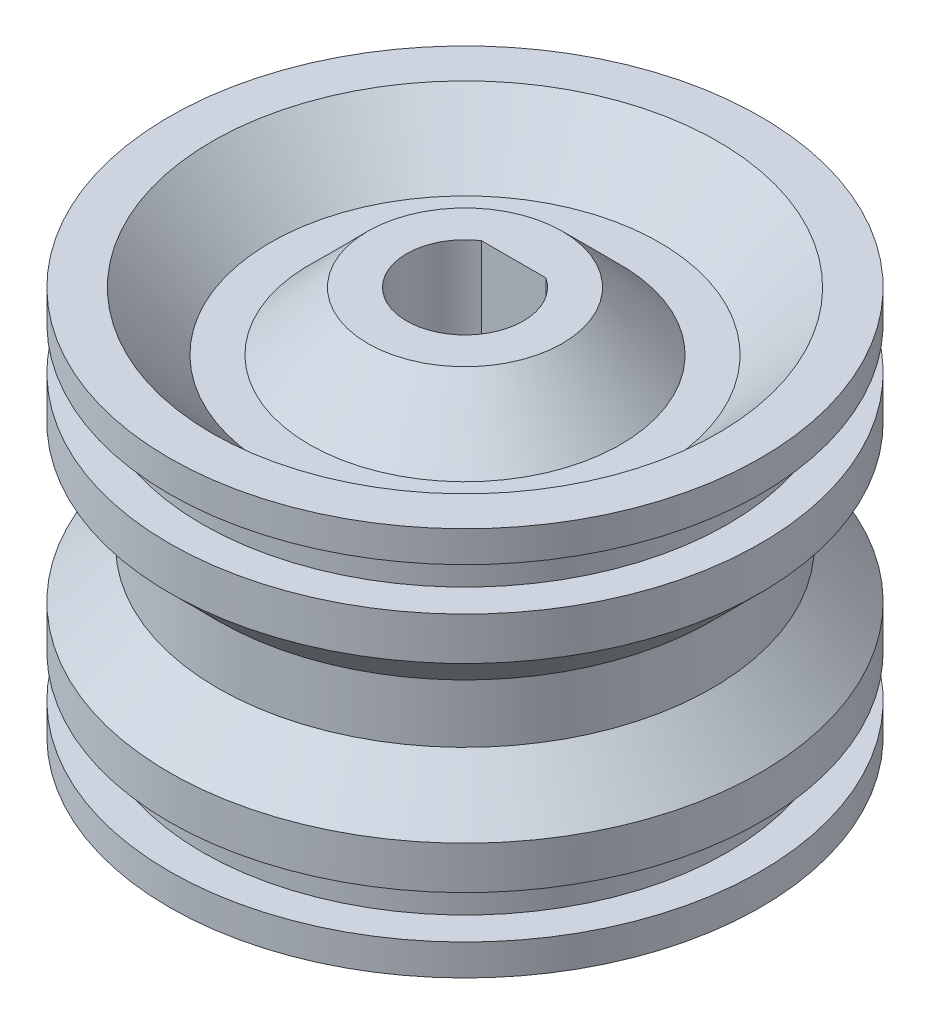
ISO-10303-21;
HEADER;
FILE_DESCRIPTION(('STEP AP214'),'2;1');
FILE_NAME('part.step','',(''),(''),'','','');
FILE_SCHEMA(('AUTOMOTIVE_DESIGN { 1 0 10303 214 1 1 1 1 }'));
ENDSEC;
DATA;
#1=APPLICATION_CONTEXT('core data for automotive mechanical design processes');
#2=APPLICATION_PROTOCOL_DEFINITION('international standard','automotive_design',2000,#1);
#3=PRODUCT_CONTEXT('',#1,'mechanical');
#4=PRODUCT('Part','Part','',(#3));
#5=PRODUCT_RELATED_PRODUCT_CATEGORY('part','',(#4));
#6=PRODUCT_DEFINITION_FORMATION('','',#4);
#7=PRODUCT_DEFINITION_CONTEXT('part definition',#1,'design');
#8=PRODUCT_DEFINITION('design','',#6,#7);
#9=PRODUCT_DEFINITION_SHAPE('','',#8);
#10=(LENGTH_UNIT() NAMED_UNIT(*) SI_UNIT(.MILLI.,.METRE.));
#11=(NAMED_UNIT(*) PLANE_ANGLE_UNIT() SI_UNIT($,.RADIAN.));
#12=(NAMED_UNIT(*) SI_UNIT($,.STERADIAN.) SOLID_ANGLE_UNIT());
#13=UNCERTAINTY_MEASURE_WITH_UNIT(LENGTH_MEASURE(1.E-05),#10,'distance_accuracy_value','');
#14=(GEOMETRIC_REPRESENTATION_CONTEXT(3) GLOBAL_UNCERTAINTY_ASSIGNED_CONTEXT((#13)) GLOBAL_UNIT_ASSIGNED_CONTEXT((#10,
#11,#12)) REPRESENTATION_CONTEXT('',''));
#15=CARTESIAN_POINT('',(0.,0.,0.));
#16=DIRECTION('',(0.,0.,1.));
#17=DIRECTION('',(1.,0.,0.));
#18=AXIS2_PLACEMENT_3D('',#15,#16,#17);
#19=CARTESIAN_POINT('',(0.,10.,0.));
#20=DIRECTION('',(0.,-1.,0.));
#21=DIRECTION('',(0.,0.,-1.));
#22=AXIS2_PLACEMENT_3D('',#19,#20,#21);
#23=CYLINDRICAL_SURFACE('',#22,15.2);
#24=CARTESIAN_POINT('',(0.,-4.,0.));
#25=DIRECTION('',(0.,-1.,0.));
#26=DIRECTION('',(0.,0.,-1.));
#27=AXIS2_PLACEMENT_3D('',#24,#25,#26);
#28=CIRCLE('',#27,15.2);
#29=CARTESIAN_POINT('',(0.,-4.,-15.2));
#30=VERTEX_POINT('',#29);
#31=EDGE_CURVE('E419',#30,#30,#28,.T.);
#32=ORIENTED_EDGE('',*,*,#31,.T.);
#33=EDGE_LOOP('',(#32));
#34=FACE_BOUND('',#33,.T.);
#35=CARTESIAN_POINT('',(0.,-6.2,0.));
#36=DIRECTION('',(0.,1.,0.));
#37=DIRECTION('',(0.,0.,1.));
#38=AXIS2_PLACEMENT_3D('',#35,#36,#37);
#39=CIRCLE('',#38,15.2);
#40=CARTESIAN_POINT('',(0.,-6.2,15.2));
#41=VERTEX_POINT('',#40);
#42=EDGE_CURVE('E103',#41,#41,#39,.T.);
#43=ORIENTED_EDGE('',*,*,#42,.T.);
#44=EDGE_LOOP('',(#43));
#45=FACE_BOUND('',#44,.T.);
#46=ADVANCED_FACE('F45',(#34,#45),#23,.T.);
#47=CARTESIAN_POINT('',(0.,10.,0.));
#48=DIRECTION('',(0.,1.,0.));
#49=DIRECTION('',(0.,0.,1.));
#50=AXIS2_PLACEMENT_3D('',#47,#48,#49);
#51=PLANE('',#50);
#52=CARTESIAN_POINT('',(0.,10.,0.));
#53=DIRECTION('',(0.,1.,0.));
#54=DIRECTION('',(0.,0.,1.));
#55=AXIS2_PLACEMENT_3D('',#52,#53,#54);
#56=CIRCLE('',#55,3.);
#57=CARTESIAN_POINT('',(-1.6583123951777,10.,-2.5));
#58=VERTEX_POINT('',#57);
#59=CARTESIAN_POINT('',(1.6583123951777,10.,-2.5));
#60=VERTEX_POINT('',#59);
#61=EDGE_CURVE('E81',#58,#60,#56,.T.);
#62=ORIENTED_EDGE('',*,*,#61,.F.);
#63=DIRECTION('',(1.,0.,0.));
#64=VECTOR('',#63,1.);
#65=CARTESIAN_POINT('',(0.,10.,-2.5));
#66=LINE('',#65,#64);
#67=EDGE_CURVE('E61',#58,#60,#66,.T.);
#68=ORIENTED_EDGE('',*,*,#67,.T.);
#69=EDGE_LOOP('',(#62,#68));
#70=FACE_BOUND('',#69,.T.);
#71=CARTESIAN_POINT('',(0.,10.,0.));
#72=DIRECTION('',(0.,1.,0.));
#73=DIRECTION('',(0.,0.,1.));
#74=AXIS2_PLACEMENT_3D('',#71,#72,#73);
#75=CIRCLE('',#74,5.);
#76=CARTESIAN_POINT('',(0.,10.,5.));
#77=VERTEX_POINT('',#76);
#78=EDGE_CURVE('E90',#77,#77,#75,.T.);
#79=ORIENTED_EDGE('',*,*,#78,.T.);
#80=EDGE_LOOP('',(#79));
#81=FACE_BOUND('',#80,.T.);
#82=ADVANCED_FACE('F85',(#70,#81),#51,.T.);
#83=CARTESIAN_POINT('',(0.,10.,0.));
#84=DIRECTION('',(0.,1.,0.));
#85=DIRECTION('',(0.,0.,1.));
#86=AXIS2_PLACEMENT_3D('',#83,#84,#85);
#87=CIRCLE('',#86,13.);
#88=CARTESIAN_POINT('',(0.,10.,13.));
#89=VERTEX_POINT('',#88);
#90=EDGE_CURVE('E136',#89,#89,#87,.F.);
#91=ORIENTED_EDGE('',*,*,#90,.T.);
#92=EDGE_LOOP('',(#91));
#93=FACE_BOUND('',#92,.T.);
#94=CARTESIAN_POINT('',(0.,10.,0.));
#95=DIRECTION('',(0.,1.,0.));
#96=DIRECTION('',(0.,0.,1.));
#97=AXIS2_PLACEMENT_3D('',#94,#95,#96);
#98=CIRCLE('',#97,15.2);
#99=CARTESIAN_POINT('',(0.,10.,15.2));
#100=VERTEX_POINT('',#99);
#101=EDGE_CURVE('E119',#100,#100,#98,.T.);
#102=ORIENTED_EDGE('',*,*,#101,.T.);
#103=EDGE_LOOP('',(#102));
#104=FACE_BOUND('',#103,.T.);
#105=ADVANCED_FACE('F170',(#93,#104),#51,.T.);
#106=CARTESIAN_POINT('',(0.,2.,0.));
#107=DIRECTION('',(0.,-1.,0.));
#108=DIRECTION('',(0.,0.,-1.));
#109=AXIS2_PLACEMENT_3D('',#106,#107,#108);
#110=PLANE('',#109);
#111=CARTESIAN_POINT('',(0.,2.,0.));
#112=DIRECTION('',(0.,-1.,0.));
#113=DIRECTION('',(0.,0.,-1.));
#114=AXIS2_PLACEMENT_3D('',#111,#112,#113);
#115=CIRCLE('',#114,7.99999999999998);
#116=CARTESIAN_POINT('',(0.,2.,-7.99999999999998));
#117=VERTEX_POINT('',#116);
#118=EDGE_CURVE('E54',#117,#117,#115,.T.);
#119=ORIENTED_EDGE('',*,*,#118,.T.);
#120=EDGE_LOOP('',(#119));
#121=FACE_BOUND('',#120,.T.);
#122=CARTESIAN_POINT('',(0.,2.,0.));
#123=DIRECTION('',(0.,-1.,0.));
#124=DIRECTION('',(0.,0.,-1.));
#125=AXIS2_PLACEMENT_3D('',#122,#123,#124);
#126=CIRCLE('',#125,3.);
#127=CARTESIAN_POINT('',(1.6583123951777,2.,-2.5));
#128=VERTEX_POINT('',#127);
#129=CARTESIAN_POINT('',(-1.6583123951777,2.,-2.5));
#130=VERTEX_POINT('',#129);
#131=EDGE_CURVE('E122',#128,#130,#126,.T.);
#132=ORIENTED_EDGE('',*,*,#131,.F.);
#133=DIRECTION('',(-1.,0.,0.));
#134=VECTOR('',#133,1.);
#135=CARTESIAN_POINT('',(0.,2.,-2.5));
#136=LINE('',#135,#134);
#137=EDGE_CURVE('E75',#128,#130,#136,.T.);
#138=ORIENTED_EDGE('',*,*,#137,.T.);
#139=EDGE_LOOP('',(#132,#138));
#140=FACE_BOUND('',#139,.T.);
#141=ADVANCED_FACE('F147',(#121,#140),#110,.T.);
#142=CARTESIAN_POINT('',(0.,4.,0.));
#143=DIRECTION('',(0.,-1.,0.));
#144=DIRECTION('',(0.,0.,-1.));
#145=AXIS2_PLACEMENT_3D('',#142,#143,#144);
#146=CIRCLE('',#145,15.2);
#147=CARTESIAN_POINT('',(0.,4.,-15.2));
#148=VERTEX_POINT('',#147);
#149=EDGE_CURVE('E413',#148,#148,#146,.T.);
#150=ORIENTED_EDGE('',*,*,#149,.F.);
#151=EDGE_LOOP('',(#150));
#152=FACE_BOUND('',#151,.T.);
#153=CARTESIAN_POINT('',(0.,6.2,0.));
#154=DIRECTION('',(0.,1.,0.));
#155=DIRECTION('',(0.,0.,1.));
#156=AXIS2_PLACEMENT_3D('',#153,#154,#155);
#157=CIRCLE('',#156,15.2);
#158=CARTESIAN_POINT('',(0.,6.2,15.2));
#159=VERTEX_POINT('',#158);
#160=EDGE_CURVE('E115',#159,#159,#157,.T.);
#161=ORIENTED_EDGE('',*,*,#160,.F.);
#162=EDGE_LOOP('',(#161));
#163=FACE_BOUND('',#162,.T.);
#164=ADVANCED_FACE('F164',(#152,#163),#23,.T.);
#165=CARTESIAN_POINT('',(15.2,6.2,0.));
#166=DIRECTION('',(0.,1.,0.));
#167=DIRECTION('',(0.,0.,1.));
#168=AXIS2_PLACEMENT_3D('',#165,#166,#167);
#169=PLANE('',#168);
#170=ORIENTED_EDGE('',*,*,#160,.T.);
#171=EDGE_LOOP('',(#170));
#172=FACE_BOUND('',#171,.T.);
#173=CARTESIAN_POINT('',(0.,6.2,0.));
#174=DIRECTION('',(0.,1.,0.));
#175=DIRECTION('',(0.,0.,1.));
#176=AXIS2_PLACEMENT_3D('',#173,#174,#175);
#177=CIRCLE('',#176,13.5);
#178=CARTESIAN_POINT('',(0.,6.2,13.5));
#179=VERTEX_POINT('',#178);
#180=EDGE_CURVE('E112',#179,#179,#177,.T.);
#181=ORIENTED_EDGE('',*,*,#180,.F.);
#182=EDGE_LOOP('',(#181));
#183=FACE_BOUND('',#182,.T.);
#184=ADVANCED_FACE('F181',(#172,#183),#169,.T.);
#185=CARTESIAN_POINT('',(0.,8.4,0.));
#186=DIRECTION('',(0.,1.,0.));
#187=DIRECTION('',(0.,0.,1.));
#188=AXIS2_PLACEMENT_3D('',#185,#186,#187);
#189=CYLINDRICAL_SURFACE('',#188,13.5);
#190=ORIENTED_EDGE('',*,*,#180,.T.);
#191=EDGE_LOOP('',(#190));
#192=FACE_BOUND('',#191,.T.);
#193=CARTESIAN_POINT('',(0.,8.4,0.));
#194=DIRECTION('',(0.,1.,0.));
#195=DIRECTION('',(0.,0.,1.));
#196=AXIS2_PLACEMENT_3D('',#193,#194,#195);
#197=CIRCLE('',#196,13.5);
#198=CARTESIAN_POINT('',(0.,8.4,13.5));
#199=VERTEX_POINT('',#198);
#200=EDGE_CURVE('E109',#199,#199,#197,.T.);
#201=ORIENTED_EDGE('',*,*,#200,.F.);
#202=EDGE_LOOP('',(#201));
#203=FACE_BOUND('',#202,.T.);
#204=ADVANCED_FACE('F187',(#192,#203),#189,.T.);
#205=CARTESIAN_POINT('',(15.2,8.4,0.));
#206=DIRECTION('',(0.,-1.,0.));
#207=DIRECTION('',(0.,0.,-1.));
#208=AXIS2_PLACEMENT_3D('',#205,#206,#207);
#209=PLANE('',#208);
#210=ORIENTED_EDGE('',*,*,#200,.T.);
#211=EDGE_LOOP('',(#210));
#212=FACE_BOUND('',#211,.T.);
#213=CARTESIAN_POINT('',(0.,8.4,0.));
#214=DIRECTION('',(0.,1.,0.));
#215=DIRECTION('',(0.,0.,1.));
#216=AXIS2_PLACEMENT_3D('',#213,#214,#215);
#217=CIRCLE('',#216,15.2);
#218=CARTESIAN_POINT('',(0.,8.4,15.2));
#219=VERTEX_POINT('',#218);
#220=EDGE_CURVE('E106',#219,#219,#217,.T.);
#221=ORIENTED_EDGE('',*,*,#220,.F.);
#222=EDGE_LOOP('',(#221));
#223=FACE_BOUND('',#222,.T.);
#224=ADVANCED_FACE('F196',(#212,#223),#209,.T.);
#225=ORIENTED_EDGE('',*,*,#101,.F.);
#226=EDGE_LOOP('',(#225));
#227=FACE_BOUND('',#226,.T.);
#228=ORIENTED_EDGE('',*,*,#220,.T.);
#229=EDGE_LOOP('',(#228));
#230=FACE_BOUND('',#229,.T.);
#231=ADVANCED_FACE('F180',(#227,#230),#23,.T.);
#232=CARTESIAN_POINT('',(15.2,-6.2,0.));
#233=DIRECTION('',(0.,-1.,0.));
#234=DIRECTION('',(0.,0.,1.));
#235=AXIS2_PLACEMENT_3D('',#232,#233,#234);
#236=PLANE('',#235);
#237=ORIENTED_EDGE('',*,*,#42,.F.);
#238=EDGE_LOOP('',(#237));
#239=FACE_BOUND('',#238,.T.);
#240=CARTESIAN_POINT('',(0.,-6.2,0.));
#241=DIRECTION('',(0.,1.,0.));
#242=DIRECTION('',(0.,0.,1.));
#243=AXIS2_PLACEMENT_3D('',#240,#241,#242);
#244=CIRCLE('',#243,13.5);
#245=CARTESIAN_POINT('',(0.,-6.2,13.5));
#246=VERTEX_POINT('',#245);
#247=EDGE_CURVE('E100',#246,#246,#244,.T.);
#248=ORIENTED_EDGE('',*,*,#247,.T.);
#249=EDGE_LOOP('',(#248));
#250=FACE_BOUND('',#249,.T.);
#251=ADVANCED_FACE('F195',(#239,#250),#236,.T.);
#252=CARTESIAN_POINT('',(0.,-8.4,0.));
#253=DIRECTION('',(0.,-1.,0.));
#254=DIRECTION('',(0.,0.,1.));
#255=AXIS2_PLACEMENT_3D('',#252,#253,#254);
#256=CYLINDRICAL_SURFACE('',#255,13.5);
#257=ORIENTED_EDGE('',*,*,#247,.F.);
#258=EDGE_LOOP('',(#257));
#259=FACE_BOUND('',#258,.T.);
#260=CARTESIAN_POINT('',(0.,-8.4,0.));
#261=DIRECTION('',(0.,1.,0.));
#262=DIRECTION('',(0.,0.,1.));
#263=AXIS2_PLACEMENT_3D('',#260,#261,#262);
#264=CIRCLE('',#263,13.5);
#265=CARTESIAN_POINT('',(0.,-8.4,13.5));
#266=VERTEX_POINT('',#265);
#267=EDGE_CURVE('E97',#266,#266,#264,.T.);
#268=ORIENTED_EDGE('',*,*,#267,.T.);
#269=EDGE_LOOP('',(#268));
#270=FACE_BOUND('',#269,.T.);
#271=ADVANCED_FACE('F202',(#259,#270),#256,.T.);
#272=CARTESIAN_POINT('',(15.2,-8.4,0.));
#273=DIRECTION('',(0.,1.,0.));
#274=DIRECTION('',(0.,0.,-1.));
#275=AXIS2_PLACEMENT_3D('',#272,#273,#274);
#276=PLANE('',#275);
#277=ORIENTED_EDGE('',*,*,#267,.F.);
#278=EDGE_LOOP('',(#277));
#279=FACE_BOUND('',#278,.T.);
#280=CARTESIAN_POINT('',(0.,-8.4,0.));
#281=DIRECTION('',(0.,1.,0.));
#282=DIRECTION('',(0.,0.,1.));
#283=AXIS2_PLACEMENT_3D('',#280,#281,#282);
#284=CIRCLE('',#283,15.2);
#285=CARTESIAN_POINT('',(0.,-8.4,15.2));
#286=VERTEX_POINT('',#285);
#287=EDGE_CURVE('E77',#286,#286,#284,.T.);
#288=ORIENTED_EDGE('',*,*,#287,.T.);
#289=EDGE_LOOP('',(#288));
#290=FACE_BOUND('',#289,.T.);
#291=ADVANCED_FACE('F219',(#279,#290),#276,.T.);
#292=CARTESIAN_POINT('',(0.,-10.,0.));
#293=DIRECTION('',(0.,1.,0.));
#294=DIRECTION('',(0.,0.,1.));
#295=AXIS2_PLACEMENT_3D('',#292,#293,#294);
#296=PLANE('',#295);
#297=CARTESIAN_POINT('',(0.,-10.,0.));
#298=DIRECTION('',(0.,1.,0.));
#299=DIRECTION('',(0.,0.,1.));
#300=AXIS2_PLACEMENT_3D('',#297,#298,#299);
#301=CIRCLE('',#300,13.);
#302=CARTESIAN_POINT('',(0.,-10.,13.));
#303=VERTEX_POINT('',#302);
#304=EDGE_CURVE('E130',#303,#303,#301,.T.);
#305=ORIENTED_EDGE('',*,*,#304,.T.);
#306=EDGE_LOOP('',(#305));
#307=FACE_BOUND('',#306,.T.);
#308=CARTESIAN_POINT('',(0.,-10.,0.));
#309=DIRECTION('',(0.,1.,0.));
#310=DIRECTION('',(0.,0.,1.));
#311=AXIS2_PLACEMENT_3D('',#308,#309,#310);
#312=CIRCLE('',#311,15.2);
#313=CARTESIAN_POINT('',(0.,-10.,15.2));
#314=VERTEX_POINT('',#313);
#315=EDGE_CURVE('E118',#314,#314,#312,.T.);
#316=ORIENTED_EDGE('',*,*,#315,.F.);
#317=EDGE_LOOP('',(#316));
#318=FACE_BOUND('',#317,.T.);
#319=ADVANCED_FACE('F178',(#307,#318),#296,.F.);
#320=ORIENTED_EDGE('',*,*,#315,.T.);
#321=EDGE_LOOP('',(#320));
#322=FACE_BOUND('',#321,.T.);
#323=ORIENTED_EDGE('',*,*,#287,.F.);
#324=EDGE_LOOP('',(#323));
#325=FACE_BOUND('',#324,.T.);
#326=ADVANCED_FACE('F163',(#322,#325),#23,.T.);
#327=CARTESIAN_POINT('',(0.,2.,0.));
#328=DIRECTION('',(0.,-1.,0.));
#329=DIRECTION('',(0.,0.,-1.));
#330=AXIS2_PLACEMENT_3D('',#327,#328,#329);
#331=CYLINDRICAL_SURFACE('',#330,9.99999999999999);
#332=CARTESIAN_POINT('',(0.,0.,0.));
#333=DIRECTION('',(0.,-1.,0.));
#334=DIRECTION('',(0.,0.,-1.));
#335=AXIS2_PLACEMENT_3D('',#332,#333,#334);
#336=CIRCLE('',#335,9.99999999999999);
#337=CARTESIAN_POINT('',(0.,0.,-9.99999999999999));
#338=VERTEX_POINT('',#337);
#339=EDGE_CURVE('E11',#338,#338,#336,.F.);
#340=ORIENTED_EDGE('',*,*,#339,.T.);
#341=EDGE_LOOP('',(#340));
#342=FACE_BOUND('',#341,.T.);
#343=CARTESIAN_POINT('',(0.,-7.,0.));
#344=DIRECTION('',(0.,1.,0.));
#345=DIRECTION('',(0.,0.,1.));
#346=AXIS2_PLACEMENT_3D('',#343,#344,#345);
#347=CIRCLE('',#346,9.99999999999999);
#348=CARTESIAN_POINT('',(0.,-7.,9.99999999999999));
#349=VERTEX_POINT('',#348);
#350=EDGE_CURVE('E127',#349,#349,#347,.F.);
#351=ORIENTED_EDGE('',*,*,#350,.T.);
#352=EDGE_LOOP('',(#351));
#353=FACE_BOUND('',#352,.T.);
#354=ADVANCED_FACE('F177',(#342,#353),#331,.F.);
#355=CARTESIAN_POINT('',(0.,-5.,-2.5));
#356=DIRECTION('',(0.,0.,1.));
#357=DIRECTION('',(1.,0.,0.));
#358=AXIS2_PLACEMENT_3D('',#355,#356,#357);
#359=PLANE('',#358);
#360=DIRECTION('',(0.,1.,0.));
#361=VECTOR('',#360,1.);
#362=CARTESIAN_POINT('',(1.6583123951777,-5.,-2.5));
#363=LINE('',#362,#361);
#364=EDGE_CURVE('E68',#128,#60,#363,.T.);
#365=ORIENTED_EDGE('',*,*,#364,.T.);
#366=ORIENTED_EDGE('',*,*,#67,.F.);
#367=DIRECTION('',(0.,1.,0.));
#368=VECTOR('',#367,1.);
#369=CARTESIAN_POINT('',(-1.6583123951777,-5.,-2.5));
#370=LINE('',#369,#368);
#371=EDGE_CURVE('E78',#130,#58,#370,.T.);
#372=ORIENTED_EDGE('',*,*,#371,.F.);
#373=ORIENTED_EDGE('',*,*,#137,.F.);
#374=EDGE_LOOP('',(#365,#366,#372,#373));
#375=FACE_BOUND('',#374,.T.);
#376=ADVANCED_FACE('F73',(#375),#359,.T.);
#377=CARTESIAN_POINT('',(0.,-5.,0.));
#378=DIRECTION('',(0.,1.,0.));
#379=DIRECTION('',(0.,0.,1.));
#380=AXIS2_PLACEMENT_3D('',#377,#378,#379);
#381=CYLINDRICAL_SURFACE('',#380,3.);
#382=ORIENTED_EDGE('',*,*,#131,.T.);
#383=ORIENTED_EDGE('',*,*,#371,.T.);
#384=ORIENTED_EDGE('',*,*,#61,.T.);
#385=ORIENTED_EDGE('',*,*,#364,.F.);
#386=EDGE_LOOP('',(#382,#383,#384,#385));
#387=FACE_BOUND('',#386,.T.);
#388=ADVANCED_FACE('F82',(#387),#381,.F.);
#389=CARTESIAN_POINT('',(0.,-7.,0.));
#390=DIRECTION('',(0.,-1.,0.));
#391=DIRECTION('',(0.,0.,-1.));
#392=AXIS2_PLACEMENT_3D('',#389,#390,#391);
#393=CONICAL_SURFACE('',#392,9.99999999999999,0.78539816339745);
#394=ORIENTED_EDGE('',*,*,#304,.F.);
#395=EDGE_LOOP('',(#394));
#396=FACE_BOUND('',#395,.T.);
#397=ORIENTED_EDGE('',*,*,#350,.F.);
#398=EDGE_LOOP('',(#397));
#399=FACE_BOUND('',#398,.T.);
#400=ADVANCED_FACE('F235',(#396,#399),#393,.F.);
#401=CARTESIAN_POINT('',(0.,7.,0.));
#402=DIRECTION('',(0.,1.,0.));
#403=DIRECTION('',(0.,0.,1.));
#404=AXIS2_PLACEMENT_3D('',#401,#402,#403);
#405=PLANE('',#404);
#406=CARTESIAN_POINT('',(0.,7.,0.));
#407=DIRECTION('',(0.,1.,0.));
#408=DIRECTION('',(0.,0.,1.));
#409=AXIS2_PLACEMENT_3D('',#406,#407,#408);
#410=CIRCLE('',#409,7.99999999999998);
#411=CARTESIAN_POINT('',(0.,7.,7.99999999999998));
#412=VERTEX_POINT('',#411);
#413=EDGE_CURVE('E133',#412,#412,#410,.F.);
#414=ORIENTED_EDGE('',*,*,#413,.T.);
#415=EDGE_LOOP('',(#414));
#416=FACE_BOUND('',#415,.T.);
#417=CARTESIAN_POINT('',(0.,7.,0.));
#418=DIRECTION('',(0.,1.,0.));
#419=DIRECTION('',(0.,0.,1.));
#420=AXIS2_PLACEMENT_3D('',#417,#418,#419);
#421=CIRCLE('',#420,10.);
#422=CARTESIAN_POINT('',(0.,7.,10.));
#423=VERTEX_POINT('',#422);
#424=EDGE_CURVE('E87',#423,#423,#421,.T.);
#425=ORIENTED_EDGE('',*,*,#424,.T.);
#426=EDGE_LOOP('',(#425));
#427=FACE_BOUND('',#426,.T.);
#428=ADVANCED_FACE('F237',(#416,#427),#405,.T.);
#429=CARTESIAN_POINT('',(0.,10.,0.));
#430=DIRECTION('',(0.,-1.,0.));
#431=DIRECTION('',(0.,0.,-1.));
#432=AXIS2_PLACEMENT_3D('',#429,#430,#431);
#433=CONICAL_SURFACE('',#432,5.,0.785398163397443);
#434=ORIENTED_EDGE('',*,*,#413,.F.);
#435=EDGE_LOOP('',(#434));
#436=FACE_BOUND('',#435,.T.);
#437=ORIENTED_EDGE('',*,*,#78,.F.);
#438=EDGE_LOOP('',(#437));
#439=FACE_BOUND('',#438,.T.);
#440=ADVANCED_FACE('F339',(#436,#439),#433,.T.);
#441=CARTESIAN_POINT('',(0.,6.99999999999999,0.));
#442=DIRECTION('',(0.,1.,0.));
#443=DIRECTION('',(0.,0.,1.));
#444=AXIS2_PLACEMENT_3D('',#441,#442,#443);
#445=CONICAL_SURFACE('',#444,10.,0.785398163397449);
#446=ORIENTED_EDGE('',*,*,#90,.F.);
#447=EDGE_LOOP('',(#446));
#448=FACE_BOUND('',#447,.T.);
#449=ORIENTED_EDGE('',*,*,#424,.F.);
#450=EDGE_LOOP('',(#449));
#451=FACE_BOUND('',#450,.T.);
#452=ADVANCED_FACE('F349',(#448,#451),#445,.F.);
#453=CARTESIAN_POINT('',(0.,2.,0.));
#454=DIRECTION('',(0.,-1.,0.));
#455=DIRECTION('',(0.,0.,-1.));
#456=AXIS2_PLACEMENT_3D('',#453,#454,#455);
#457=CYLINDRICAL_SURFACE('',#456,12.7);
#458=CARTESIAN_POINT('',(0.,1.49999999999997,0.));
#459=DIRECTION('',(0.,1.,0.));
#460=DIRECTION('',(0.,0.,1.));
#461=AXIS2_PLACEMENT_3D('',#458,#459,#460);
#462=CIRCLE('',#461,12.7);
#463=CARTESIAN_POINT('',(0.,1.49999999999997,12.7));
#464=VERTEX_POINT('',#463);
#465=EDGE_CURVE('E142',#464,#464,#462,.F.);
#466=ORIENTED_EDGE('',*,*,#465,.T.);
#467=EDGE_LOOP('',(#466));
#468=FACE_BOUND('',#467,.T.);
#469=CARTESIAN_POINT('',(0.,-1.50000000000001,0.));
#470=DIRECTION('',(0.,-1.,0.));
#471=DIRECTION('',(0.,0.,-1.));
#472=AXIS2_PLACEMENT_3D('',#469,#470,#471);
#473=CIRCLE('',#472,12.7);
#474=CARTESIAN_POINT('',(0.,-1.50000000000001,-12.7));
#475=VERTEX_POINT('',#474);
#476=EDGE_CURVE('E139',#475,#475,#473,.F.);
#477=ORIENTED_EDGE('',*,*,#476,.T.);
#478=EDGE_LOOP('',(#477));
#479=FACE_BOUND('',#478,.T.);
#480=ADVANCED_FACE('F358',(#468,#479),#457,.T.);
#481=CARTESIAN_POINT('',(0.,1.49999999999997,0.));
#482=DIRECTION('',(0.,1.,0.));
#483=DIRECTION('',(0.,0.,1.));
#484=AXIS2_PLACEMENT_3D('',#481,#482,#483);
#485=CONICAL_SURFACE('',#484,12.7,0.785398163397443);
#486=ORIENTED_EDGE('',*,*,#149,.T.);
#487=EDGE_LOOP('',(#486));
#488=FACE_BOUND('',#487,.T.);
#489=ORIENTED_EDGE('',*,*,#465,.F.);
#490=EDGE_LOOP('',(#489));
#491=FACE_BOUND('',#490,.T.);
#492=ADVANCED_FACE('F157',(#488,#491),#485,.T.);
#493=CARTESIAN_POINT('',(0.,-4.,0.));
#494=DIRECTION('',(0.,-1.,0.));
#495=DIRECTION('',(0.,0.,-1.));
#496=AXIS2_PLACEMENT_3D('',#493,#494,#495);
#497=CONICAL_SURFACE('',#496,15.2,0.785398163397454);
#498=ORIENTED_EDGE('',*,*,#476,.F.);
#499=EDGE_LOOP('',(#498));
#500=FACE_BOUND('',#499,.T.);
#501=ORIENTED_EDGE('',*,*,#31,.F.);
#502=EDGE_LOOP('',(#501));
#503=FACE_BOUND('',#502,.T.);
#504=ADVANCED_FACE('F151',(#500,#503),#497,.T.);
#505=CARTESIAN_POINT('',(0.,2.,0.));
#506=DIRECTION('',(0.,-1.,0.));
#507=DIRECTION('',(0.,0.,-1.));
#508=AXIS2_PLACEMENT_3D('',#505,#506,#507);
#509=CONICAL_SURFACE('',#508,7.99999999999998,0.785398163397453);
#510=ORIENTED_EDGE('',*,*,#339,.F.);
#511=EDGE_LOOP('',(#510));
#512=FACE_BOUND('',#511,.T.);
#513=ORIENTED_EDGE('',*,*,#118,.F.);
#514=EDGE_LOOP('',(#513));
#515=FACE_BOUND('',#514,.T.);
#516=ADVANCED_FACE('F48',(#512,#515),#509,.F.);
#517=CLOSED_SHELL('',(#46,#82,#105,#141,#164,#184,#204,#224,#231,#251,#271,#291,#319,#326,#354,
#376,#388,#400,#428,#440,#452,#480,#492,#504,#516));
#518=MANIFOLD_SOLID_BREP('B2',#517);
#519=ADVANCED_BREP_SHAPE_REPRESENTATION('',(#18,#518),#14);
#520=SHAPE_DEFINITION_REPRESENTATION(#9,#519);
ENDSEC;
END-ISO-10303-21;
